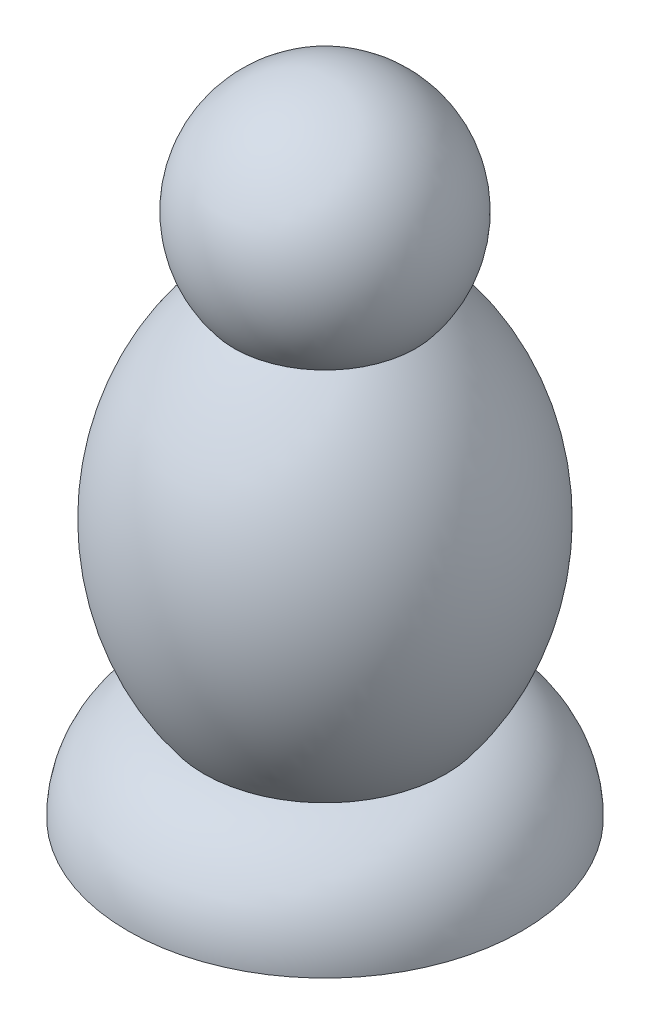
ISO-10303-21;
HEADER;
FILE_DESCRIPTION(('STEP AP214'),'2;1');
FILE_NAME('part.step','',(''),(''),'','','');
FILE_SCHEMA(('AUTOMOTIVE_DESIGN { 1 0 10303 214 1 1 1 1 }'));
ENDSEC;
DATA;
#1=APPLICATION_CONTEXT('core data for automotive mechanical design processes');
#2=APPLICATION_PROTOCOL_DEFINITION('international standard','automotive_design',2000,#1);
#3=PRODUCT_CONTEXT('',#1,'mechanical');
#4=PRODUCT('Part','Part','',(#3));
#5=PRODUCT_RELATED_PRODUCT_CATEGORY('part','',(#4));
#6=PRODUCT_DEFINITION_FORMATION('','',#4);
#7=PRODUCT_DEFINITION_CONTEXT('part definition',#1,'design');
#8=PRODUCT_DEFINITION('design','',#6,#7);
#9=PRODUCT_DEFINITION_SHAPE('','',#8);
#10=(LENGTH_UNIT() NAMED_UNIT(*) SI_UNIT(.MILLI.,.METRE.));
#11=(NAMED_UNIT(*) PLANE_ANGLE_UNIT() SI_UNIT($,.RADIAN.));
#12=(NAMED_UNIT(*) SI_UNIT($,.STERADIAN.) SOLID_ANGLE_UNIT());
#13=UNCERTAINTY_MEASURE_WITH_UNIT(LENGTH_MEASURE(1.E-05),#10,'distance_accuracy_value','');
#14=(GEOMETRIC_REPRESENTATION_CONTEXT(3) GLOBAL_UNCERTAINTY_ASSIGNED_CONTEXT((#13)) GLOBAL_UNIT_ASSIGNED_CONTEXT((#10,
#11,#12)) REPRESENTATION_CONTEXT('',''));
#15=CARTESIAN_POINT('',(0.,0.,0.));
#16=DIRECTION('',(0.,0.,1.));
#17=DIRECTION('',(1.,0.,0.));
#18=AXIS2_PLACEMENT_3D('',#15,#16,#17);
#19=CARTESIAN_POINT('',(0.,0.,0.));
#20=DIRECTION('',(0.,-1.,0.));
#21=DIRECTION('',(0.,0.,-1.));
#22=AXIS2_PLACEMENT_3D('',#19,#20,#21);
#23=PLANE('',#22);
#24=CARTESIAN_POINT('',(0.,0.,0.));
#25=DIRECTION('',(0.,-1.,0.));
#26=DIRECTION('',(0.,0.,-1.));
#27=AXIS2_PLACEMENT_3D('',#24,#25,#26);
#28=CIRCLE('',#27,7.5);
#29=CARTESIAN_POINT('',(0.,0.,-7.5));
#30=VERTEX_POINT('',#29);
#31=EDGE_CURVE('E10',#30,#30,#28,.T.);
#32=ORIENTED_EDGE('',*,*,#31,.T.);
#33=EDGE_LOOP('',(#32));
#34=FACE_BOUND('',#33,.T.);
#35=ADVANCED_FACE('F31',(#34),#23,.T.);
#36=CARTESIAN_POINT('',(0.,0.,0.));
#37=DIRECTION('',(0.,-1.,0.));
#38=DIRECTION('',(0.,0.,-1.));
#39=AXIS2_PLACEMENT_3D('',#36,#37,#38);
#40=DEGENERATE_TOROIDAL_SURFACE('',#39,3.63352314756315,3.86647685243685,.T.);
#41=CARTESIAN_POINT('',(0.,3.7406758143222,0.));
#42=DIRECTION('',(0.,-1.,0.));
#43=DIRECTION('',(0.,0.,-1.));
#44=AXIS2_PLACEMENT_3D('',#41,#42,#43);
#45=CIRCLE('',#44,4.61178063032265);
#46=CARTESIAN_POINT('',(0.,3.7406758143222,-4.61178063032265));
#47=VERTEX_POINT('',#46);
#48=EDGE_CURVE('E37',#47,#47,#45,.T.);
#49=ORIENTED_EDGE('',*,*,#48,.T.);
#50=EDGE_LOOP('',(#49));
#51=FACE_BOUND('',#50,.T.);
#52=ORIENTED_EDGE('',*,*,#31,.F.);
#53=EDGE_LOOP('',(#52));
#54=FACE_BOUND('',#53,.T.);
#55=ADVANCED_FACE('F57',(#51,#54),#40,.T.);
#56=CARTESIAN_POINT('',(0.,9.84069642612826,0.));
#57=DIRECTION('',(0.,-1.,0.));
#58=DIRECTION('',(0.,0.,-1.));
#59=AXIS2_PLACEMENT_3D('',#56,#57,#58);
#60=DEGENERATE_TOROIDAL_SURFACE('',#59,3.44065783628545,10.102079821649,.F.);
#61=CARTESIAN_POINT('',(0.,17.2103047673639,0.));
#62=DIRECTION('',(0.,-1.,0.));
#63=DIRECTION('',(0.,0.,-1.));
#64=AXIS2_PLACEMENT_3D('',#61,#62,#63);
#65=CIRCLE('',#64,3.4688204088325);
#66=CARTESIAN_POINT('',(0.,17.2103047673639,-3.4688204088325));
#67=VERTEX_POINT('',#66);
#68=EDGE_CURVE('E41',#67,#67,#65,.T.);
#69=ORIENTED_EDGE('',*,*,#68,.T.);
#70=EDGE_LOOP('',(#69));
#71=FACE_BOUND('',#70,.T.);
#72=ORIENTED_EDGE('',*,*,#48,.F.);
#73=EDGE_LOOP('',(#72));
#74=FACE_BOUND('',#73,.T.);
#75=ADVANCED_FACE('F48',(#71,#74),#60,.F.);
#76=CARTESIAN_POINT('',(0.,20.,0.));
#77=DIRECTION('',(0.,-1.,0.));
#78=DIRECTION('',(1.,0.,0.));
#79=AXIS2_PLACEMENT_3D('',#76,#77,#78);
#80=SPHERICAL_SURFACE('',#79,4.45141713611804);
#81=ORIENTED_EDGE('',*,*,#68,.F.);
#82=EDGE_LOOP('',(#81));
#83=FACE_BOUND('',#82,.T.);
#84=ADVANCED_FACE('F51',(#83),#80,.T.);
#85=CLOSED_SHELL('',(#35,#55,#75,#84));
#86=MANIFOLD_SOLID_BREP('B2',#85);
#87=ADVANCED_BREP_SHAPE_REPRESENTATION('',(#18,#86),#14);
#88=SHAPE_DEFINITION_REPRESENTATION(#9,#87);
ENDSEC;
END-ISO-10303-21;
